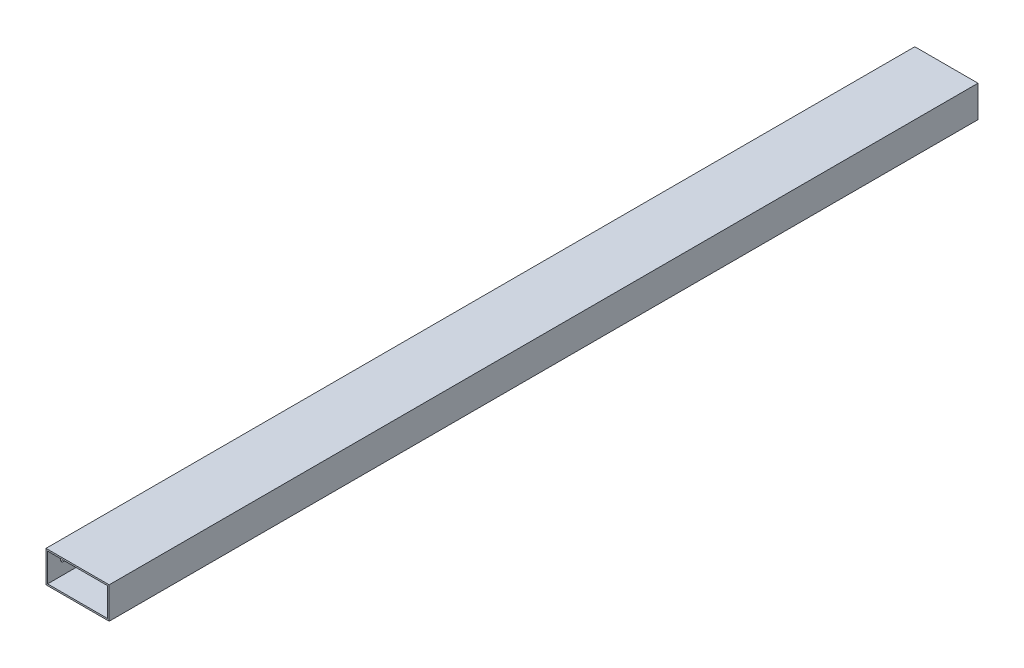
ISO-10303-21;
HEADER;
FILE_DESCRIPTION(('STEP AP214'),'2;1');
FILE_NAME('part.step','',(''),(''),'','','');
FILE_SCHEMA(('AUTOMOTIVE_DESIGN { 1 0 10303 214 1 1 1 1 }'));
ENDSEC;
DATA;
#1=APPLICATION_CONTEXT('core data for automotive mechanical design processes');
#2=APPLICATION_PROTOCOL_DEFINITION('international standard','automotive_design',2000,#1);
#3=PRODUCT_CONTEXT('',#1,'mechanical');
#4=PRODUCT('Part','Part','',(#3));
#5=PRODUCT_RELATED_PRODUCT_CATEGORY('part','',(#4));
#6=PRODUCT_DEFINITION_FORMATION('','',#4);
#7=PRODUCT_DEFINITION_CONTEXT('part definition',#1,'design');
#8=PRODUCT_DEFINITION('design','',#6,#7);
#9=PRODUCT_DEFINITION_SHAPE('','',#8);
#10=(LENGTH_UNIT() NAMED_UNIT(*) SI_UNIT(.MILLI.,.METRE.));
#11=(NAMED_UNIT(*) PLANE_ANGLE_UNIT() SI_UNIT($,.RADIAN.));
#12=(NAMED_UNIT(*) SI_UNIT($,.STERADIAN.) SOLID_ANGLE_UNIT());
#13=UNCERTAINTY_MEASURE_WITH_UNIT(LENGTH_MEASURE(1.E-05),#10,'distance_accuracy_value','');
#14=(GEOMETRIC_REPRESENTATION_CONTEXT(3) GLOBAL_UNCERTAINTY_ASSIGNED_CONTEXT((#13)) GLOBAL_UNIT_ASSIGNED_CONTEXT((#10,
#11,#12)) REPRESENTATION_CONTEXT('',''));
#15=CARTESIAN_POINT('',(0.,0.,0.));
#16=DIRECTION('',(0.,0.,1.));
#17=DIRECTION('',(1.,0.,0.));
#18=AXIS2_PLACEMENT_3D('',#15,#16,#17);
#19=CARTESIAN_POINT('',(0.,0.,550.));
#20=DIRECTION('',(0.,0.,1.));
#21=DIRECTION('',(1.,0.,0.));
#22=AXIS2_PLACEMENT_3D('',#19,#20,#21);
#23=PLANE('',#22);
#24=DIRECTION('',(0.,-1.,0.));
#25=VECTOR('',#24,1.);
#26=CARTESIAN_POINT('',(0.,0.,550.));
#27=LINE('',#26,#25);
#28=CARTESIAN_POINT('',(0.,0.,550.));
#29=VERTEX_POINT('',#28);
#30=CARTESIAN_POINT('',(0.,-20.,550.));
#31=VERTEX_POINT('',#30);
#32=EDGE_CURVE('E169',#29,#31,#27,.T.);
#33=ORIENTED_EDGE('',*,*,#32,.T.);
#34=DIRECTION('',(1.,0.,0.));
#35=VECTOR('',#34,1.);
#36=CARTESIAN_POINT('',(0.,-20.,550.));
#37=LINE('',#36,#35);
#38=CARTESIAN_POINT('',(40.,-20.,550.));
#39=VERTEX_POINT('',#38);
#40=EDGE_CURVE('E172',#31,#39,#37,.T.);
#41=ORIENTED_EDGE('',*,*,#40,.T.);
#42=DIRECTION('',(0.,1.,0.));
#43=VECTOR('',#42,1.);
#44=CARTESIAN_POINT('',(40.,0.,550.));
#45=LINE('',#44,#43);
#46=CARTESIAN_POINT('',(40.,0.,550.));
#47=VERTEX_POINT('',#46);
#48=EDGE_CURVE('E175',#39,#47,#45,.T.);
#49=ORIENTED_EDGE('',*,*,#48,.T.);
#50=DIRECTION('',(-1.,0.,0.));
#51=VECTOR('',#50,1.);
#52=CARTESIAN_POINT('',(0.,0.,550.));
#53=LINE('',#52,#51);
#54=EDGE_CURVE('E177',#47,#29,#53,.T.);
#55=ORIENTED_EDGE('',*,*,#54,.T.);
#56=EDGE_LOOP('',(#33,#41,#49,#55));
#57=FACE_BOUND('',#56,.T.);
#58=DIRECTION('',(1.,0.,0.));
#59=VECTOR('',#58,1.);
#60=CARTESIAN_POINT('',(0.,-19.,550.));
#61=LINE('',#60,#59);
#62=CARTESIAN_POINT('',(1.,-19.,550.));
#63=VERTEX_POINT('',#62);
#64=CARTESIAN_POINT('',(39.,-19.,550.));
#65=VERTEX_POINT('',#64);
#66=EDGE_CURVE('E140',#63,#65,#61,.T.);
#67=ORIENTED_EDGE('',*,*,#66,.F.);
#68=DIRECTION('',(0.,-1.,0.));
#69=VECTOR('',#68,1.);
#70=CARTESIAN_POINT('',(1.,0.,550.));
#71=LINE('',#70,#69);
#72=CARTESIAN_POINT('',(1.,-1.,550.));
#73=VERTEX_POINT('',#72);
#74=EDGE_CURVE('E132',#73,#63,#71,.T.);
#75=ORIENTED_EDGE('',*,*,#74,.F.);
#76=DIRECTION('',(-1.,0.,0.));
#77=VECTOR('',#76,1.);
#78=CARTESIAN_POINT('',(0.,-1.,550.));
#79=LINE('',#78,#77);
#80=CARTESIAN_POINT('',(39.,-1.,550.));
#81=VERTEX_POINT('',#80);
#82=EDGE_CURVE('E154',#81,#73,#79,.T.);
#83=ORIENTED_EDGE('',*,*,#82,.F.);
#84=DIRECTION('',(0.,1.,0.));
#85=VECTOR('',#84,1.);
#86=CARTESIAN_POINT('',(39.,0.,550.));
#87=LINE('',#86,#85);
#88=EDGE_CURVE('E152',#65,#81,#87,.T.);
#89=ORIENTED_EDGE('',*,*,#88,.F.);
#90=EDGE_LOOP('',(#67,#75,#83,#89));
#91=FACE_BOUND('',#90,.T.);
#92=ADVANCED_FACE('F65',(#57,#91),#23,.T.);
#93=CARTESIAN_POINT('',(0.,0.,0.));
#94=DIRECTION('',(0.,0.,1.));
#95=DIRECTION('',(1.,0.,0.));
#96=AXIS2_PLACEMENT_3D('',#93,#94,#95);
#97=PLANE('',#96);
#98=DIRECTION('',(0.,-1.,0.));
#99=VECTOR('',#98,1.);
#100=CARTESIAN_POINT('',(0.,0.,0.));
#101=LINE('',#100,#99);
#102=CARTESIAN_POINT('',(0.,0.,0.));
#103=VERTEX_POINT('',#102);
#104=CARTESIAN_POINT('',(0.,-20.,0.));
#105=VERTEX_POINT('',#104);
#106=EDGE_CURVE('E148',#103,#105,#101,.T.);
#107=ORIENTED_EDGE('',*,*,#106,.F.);
#108=DIRECTION('',(-1.,0.,0.));
#109=VECTOR('',#108,1.);
#110=CARTESIAN_POINT('',(0.,0.,0.));
#111=LINE('',#110,#109);
#112=CARTESIAN_POINT('',(40.,0.,0.));
#113=VERTEX_POINT('',#112);
#114=EDGE_CURVE('E173',#113,#103,#111,.T.);
#115=ORIENTED_EDGE('',*,*,#114,.F.);
#116=DIRECTION('',(0.,1.,0.));
#117=VECTOR('',#116,1.);
#118=CARTESIAN_POINT('',(40.,0.,0.));
#119=LINE('',#118,#117);
#120=CARTESIAN_POINT('',(40.,-20.,0.));
#121=VERTEX_POINT('',#120);
#122=EDGE_CURVE('E184',#121,#113,#119,.T.);
#123=ORIENTED_EDGE('',*,*,#122,.F.);
#124=DIRECTION('',(1.,0.,0.));
#125=VECTOR('',#124,1.);
#126=CARTESIAN_POINT('',(0.,-20.,0.));
#127=LINE('',#126,#125);
#128=EDGE_CURVE('E182',#105,#121,#127,.T.);
#129=ORIENTED_EDGE('',*,*,#128,.F.);
#130=EDGE_LOOP('',(#107,#115,#123,#129));
#131=FACE_BOUND('',#130,.T.);
#132=DIRECTION('',(0.,-1.,0.));
#133=VECTOR('',#132,1.);
#134=CARTESIAN_POINT('',(1.,0.,0.));
#135=LINE('',#134,#133);
#136=CARTESIAN_POINT('',(1.,-1.,0.));
#137=VERTEX_POINT('',#136);
#138=CARTESIAN_POINT('',(1.,-19.,0.));
#139=VERTEX_POINT('',#138);
#140=EDGE_CURVE('E90',#137,#139,#135,.T.);
#141=ORIENTED_EDGE('',*,*,#140,.T.);
#142=DIRECTION('',(1.,0.,0.));
#143=VECTOR('',#142,1.);
#144=CARTESIAN_POINT('',(0.,-19.,0.));
#145=LINE('',#144,#143);
#146=CARTESIAN_POINT('',(39.,-19.,0.));
#147=VERTEX_POINT('',#146);
#148=EDGE_CURVE('E147',#139,#147,#145,.T.);
#149=ORIENTED_EDGE('',*,*,#148,.T.);
#150=DIRECTION('',(0.,1.,0.));
#151=VECTOR('',#150,1.);
#152=CARTESIAN_POINT('',(39.,0.,0.));
#153=LINE('',#152,#151);
#154=CARTESIAN_POINT('',(39.,-1.,0.));
#155=VERTEX_POINT('',#154);
#156=EDGE_CURVE('E161',#147,#155,#153,.T.);
#157=ORIENTED_EDGE('',*,*,#156,.T.);
#158=DIRECTION('',(-1.,0.,0.));
#159=VECTOR('',#158,1.);
#160=CARTESIAN_POINT('',(0.,-1.,0.));
#161=LINE('',#160,#159);
#162=EDGE_CURVE('E141',#155,#137,#161,.T.);
#163=ORIENTED_EDGE('',*,*,#162,.T.);
#164=EDGE_LOOP('',(#141,#149,#157,#163));
#165=FACE_BOUND('',#164,.T.);
#166=ADVANCED_FACE('F212',(#131,#165),#97,.F.);
#167=CARTESIAN_POINT('',(0.,0.,550.));
#168=DIRECTION('',(1.,0.,0.));
#169=DIRECTION('',(0.,0.,-1.));
#170=AXIS2_PLACEMENT_3D('',#167,#168,#169);
#171=PLANE('',#170);
#172=CARTESIAN_POINT('',(0.,-10.,539.996387591484));
#173=DIRECTION('',(-1.,0.,0.));
#174=DIRECTION('',(0.,0.,1.));
#175=AXIS2_PLACEMENT_3D('',#172,#173,#174);
#176=CIRCLE('',#175,1.7500000000001);
#177=CARTESIAN_POINT('',(0.,-10.,541.746387591484));
#178=VERTEX_POINT('',#177);
#179=EDGE_CURVE('E195',#178,#178,#176,.T.);
#180=ORIENTED_EDGE('',*,*,#179,.F.);
#181=EDGE_LOOP('',(#180));
#182=FACE_BOUND('',#181,.T.);
#183=CARTESIAN_POINT('',(0.,-10.0000000016865,9.99999999971425));
#184=DIRECTION('',(-1.,0.,0.));
#185=DIRECTION('',(0.,0.,1.));
#186=AXIS2_PLACEMENT_3D('',#183,#184,#185);
#187=CIRCLE('',#186,1.75000000027376);
#188=CARTESIAN_POINT('',(0.,-10.0000000016865,11.749999999988));
#189=VERTEX_POINT('',#188);
#190=EDGE_CURVE('E200',#189,#189,#187,.T.);
#191=ORIENTED_EDGE('',*,*,#190,.F.);
#192=EDGE_LOOP('',(#191));
#193=FACE_BOUND('',#192,.T.);
#194=ORIENTED_EDGE('',*,*,#106,.T.);
#195=DIRECTION('',(0.,0.,-1.));
#196=VECTOR('',#195,1.);
#197=CARTESIAN_POINT('',(0.,-20.,550.));
#198=LINE('',#197,#196);
#199=EDGE_CURVE('E12',#31,#105,#198,.T.);
#200=ORIENTED_EDGE('',*,*,#199,.F.);
#201=ORIENTED_EDGE('',*,*,#32,.F.);
#202=DIRECTION('',(0.,0.,-1.));
#203=VECTOR('',#202,1.);
#204=CARTESIAN_POINT('',(0.,0.,550.));
#205=LINE('',#204,#203);
#206=EDGE_CURVE('E179',#29,#103,#205,.T.);
#207=ORIENTED_EDGE('',*,*,#206,.T.);
#208=EDGE_LOOP('',(#194,#200,#201,#207));
#209=FACE_BOUND('',#208,.T.);
#210=ADVANCED_FACE('F67',(#182,#193,#209),#171,.F.);
#211=CARTESIAN_POINT('',(0.,-20.,550.));
#212=DIRECTION('',(0.,1.,0.));
#213=DIRECTION('',(0.,0.,1.));
#214=AXIS2_PLACEMENT_3D('',#211,#212,#213);
#215=PLANE('',#214);
#216=ORIENTED_EDGE('',*,*,#128,.T.);
#217=DIRECTION('',(0.,0.,-1.));
#218=VECTOR('',#217,1.);
#219=CARTESIAN_POINT('',(40.,-20.,550.));
#220=LINE('',#219,#218);
#221=EDGE_CURVE('E74',#39,#121,#220,.T.);
#222=ORIENTED_EDGE('',*,*,#221,.F.);
#223=ORIENTED_EDGE('',*,*,#40,.F.);
#224=ORIENTED_EDGE('',*,*,#199,.T.);
#225=EDGE_LOOP('',(#216,#222,#223,#224));
#226=FACE_BOUND('',#225,.T.);
#227=ADVANCED_FACE('F211',(#226),#215,.F.);
#228=CARTESIAN_POINT('',(40.,0.,550.));
#229=DIRECTION('',(-1.,0.,0.));
#230=DIRECTION('',(0.,0.,1.));
#231=AXIS2_PLACEMENT_3D('',#228,#229,#230);
#232=PLANE('',#231);
#233=ORIENTED_EDGE('',*,*,#122,.T.);
#234=DIRECTION('',(0.,0.,-1.));
#235=VECTOR('',#234,1.);
#236=CARTESIAN_POINT('',(40.,0.,550.));
#237=LINE('',#236,#235);
#238=EDGE_CURVE('E189',#47,#113,#237,.T.);
#239=ORIENTED_EDGE('',*,*,#238,.F.);
#240=ORIENTED_EDGE('',*,*,#48,.F.);
#241=ORIENTED_EDGE('',*,*,#221,.T.);
#242=EDGE_LOOP('',(#233,#239,#240,#241));
#243=FACE_BOUND('',#242,.T.);
#244=ADVANCED_FACE('F231',(#243),#232,.F.);
#245=CARTESIAN_POINT('',(0.,0.,550.));
#246=DIRECTION('',(0.,-1.,0.));
#247=DIRECTION('',(0.,0.,-1.));
#248=AXIS2_PLACEMENT_3D('',#245,#246,#247);
#249=PLANE('',#248);
#250=ORIENTED_EDGE('',*,*,#114,.T.);
#251=ORIENTED_EDGE('',*,*,#206,.F.);
#252=ORIENTED_EDGE('',*,*,#54,.F.);
#253=ORIENTED_EDGE('',*,*,#238,.T.);
#254=EDGE_LOOP('',(#250,#251,#252,#253));
#255=FACE_BOUND('',#254,.T.);
#256=ADVANCED_FACE('F229',(#255),#249,.F.);
#257=CARTESIAN_POINT('',(1.,0.,550.));
#258=DIRECTION('',(1.,0.,0.));
#259=DIRECTION('',(0.,0.,-1.));
#260=AXIS2_PLACEMENT_3D('',#257,#258,#259);
#261=PLANE('',#260);
#262=CARTESIAN_POINT('',(1.,-10.,539.996387591484));
#263=DIRECTION('',(1.,0.,0.));
#264=DIRECTION('',(0.,0.,-1.));
#265=AXIS2_PLACEMENT_3D('',#262,#263,#264);
#266=CIRCLE('',#265,1.7500000000001);
#267=CARTESIAN_POINT('',(1.,-10.,538.246387591484));
#268=VERTEX_POINT('',#267);
#269=EDGE_CURVE('E69',#268,#268,#266,.T.);
#270=ORIENTED_EDGE('',*,*,#269,.F.);
#271=EDGE_LOOP('',(#270));
#272=FACE_BOUND('',#271,.T.);
#273=CARTESIAN_POINT('',(1.,-10.0000000016865,9.99999999971425));
#274=DIRECTION('',(1.,0.,0.));
#275=DIRECTION('',(0.,0.,-1.));
#276=AXIS2_PLACEMENT_3D('',#273,#274,#275);
#277=CIRCLE('',#276,1.75000000027376);
#278=CARTESIAN_POINT('',(1.,-10.0000000016865,8.24999999944049));
#279=VERTEX_POINT('',#278);
#280=EDGE_CURVE('E193',#279,#279,#277,.T.);
#281=ORIENTED_EDGE('',*,*,#280,.F.);
#282=EDGE_LOOP('',(#281));
#283=FACE_BOUND('',#282,.T.);
#284=ORIENTED_EDGE('',*,*,#140,.F.);
#285=DIRECTION('',(0.,0.,-1.));
#286=VECTOR('',#285,1.);
#287=CARTESIAN_POINT('',(1.,-1.,550.));
#288=LINE('',#287,#286);
#289=EDGE_CURVE('E136',#73,#137,#288,.T.);
#290=ORIENTED_EDGE('',*,*,#289,.F.);
#291=ORIENTED_EDGE('',*,*,#74,.T.);
#292=DIRECTION('',(0.,0.,-1.));
#293=VECTOR('',#292,1.);
#294=CARTESIAN_POINT('',(1.,-19.,550.));
#295=LINE('',#294,#293);
#296=EDGE_CURVE('E135',#63,#139,#295,.T.);
#297=ORIENTED_EDGE('',*,*,#296,.T.);
#298=EDGE_LOOP('',(#284,#290,#291,#297));
#299=FACE_BOUND('',#298,.T.);
#300=ADVANCED_FACE('F134',(#272,#283,#299),#261,.T.);
#301=CARTESIAN_POINT('',(0.,-19.,550.));
#302=DIRECTION('',(0.,1.,0.));
#303=DIRECTION('',(0.,0.,1.));
#304=AXIS2_PLACEMENT_3D('',#301,#302,#303);
#305=PLANE('',#304);
#306=ORIENTED_EDGE('',*,*,#148,.F.);
#307=ORIENTED_EDGE('',*,*,#296,.F.);
#308=ORIENTED_EDGE('',*,*,#66,.T.);
#309=DIRECTION('',(0.,0.,-1.));
#310=VECTOR('',#309,1.);
#311=CARTESIAN_POINT('',(39.,-19.,550.));
#312=LINE('',#311,#310);
#313=EDGE_CURVE('E149',#65,#147,#312,.T.);
#314=ORIENTED_EDGE('',*,*,#313,.T.);
#315=EDGE_LOOP('',(#306,#307,#308,#314));
#316=FACE_BOUND('',#315,.T.);
#317=ADVANCED_FACE('F144',(#316),#305,.T.);
#318=CARTESIAN_POINT('',(39.,0.,550.));
#319=DIRECTION('',(-1.,0.,0.));
#320=DIRECTION('',(0.,0.,1.));
#321=AXIS2_PLACEMENT_3D('',#318,#319,#320);
#322=PLANE('',#321);
#323=ORIENTED_EDGE('',*,*,#156,.F.);
#324=ORIENTED_EDGE('',*,*,#313,.F.);
#325=ORIENTED_EDGE('',*,*,#88,.T.);
#326=DIRECTION('',(0.,0.,-1.));
#327=VECTOR('',#326,1.);
#328=CARTESIAN_POINT('',(39.,-1.,550.));
#329=LINE('',#328,#327);
#330=EDGE_CURVE('E82',#81,#155,#329,.T.);
#331=ORIENTED_EDGE('',*,*,#330,.T.);
#332=EDGE_LOOP('',(#323,#324,#325,#331));
#333=FACE_BOUND('',#332,.T.);
#334=ADVANCED_FACE('F251',(#333),#322,.T.);
#335=CARTESIAN_POINT('',(0.,-1.,550.));
#336=DIRECTION('',(0.,-1.,0.));
#337=DIRECTION('',(0.,0.,-1.));
#338=AXIS2_PLACEMENT_3D('',#335,#336,#337);
#339=PLANE('',#338);
#340=ORIENTED_EDGE('',*,*,#162,.F.);
#341=ORIENTED_EDGE('',*,*,#330,.F.);
#342=ORIENTED_EDGE('',*,*,#82,.T.);
#343=ORIENTED_EDGE('',*,*,#289,.T.);
#344=EDGE_LOOP('',(#340,#341,#342,#343));
#345=FACE_BOUND('',#344,.T.);
#346=ADVANCED_FACE('F254',(#345),#339,.T.);
#347=CARTESIAN_POINT('',(1.5,-10.0000000016865,9.99999999971425));
#348=DIRECTION('',(-1.,0.,0.));
#349=DIRECTION('',(0.,0.,1.));
#350=AXIS2_PLACEMENT_3D('',#347,#348,#349);
#351=CYLINDRICAL_SURFACE('',#350,1.75000000027376);
#352=ORIENTED_EDGE('',*,*,#280,.T.);
#353=EDGE_LOOP('',(#352));
#354=FACE_BOUND('',#353,.T.);
#355=ORIENTED_EDGE('',*,*,#190,.T.);
#356=EDGE_LOOP('',(#355));
#357=FACE_BOUND('',#356,.T.);
#358=ADVANCED_FACE('F207',(#354,#357),#351,.F.);
#359=CARTESIAN_POINT('',(1.5,-10.,539.996387591484));
#360=DIRECTION('',(-1.,0.,0.));
#361=DIRECTION('',(0.,0.,1.));
#362=AXIS2_PLACEMENT_3D('',#359,#360,#361);
#363=CYLINDRICAL_SURFACE('',#362,1.7500000000001);
#364=ORIENTED_EDGE('',*,*,#269,.T.);
#365=EDGE_LOOP('',(#364));
#366=FACE_BOUND('',#365,.T.);
#367=ORIENTED_EDGE('',*,*,#179,.T.);
#368=EDGE_LOOP('',(#367));
#369=FACE_BOUND('',#368,.T.);
#370=ADVANCED_FACE('F260',(#366,#369),#363,.F.);
#371=CLOSED_SHELL('',(#92,#166,#210,#227,#244,#256,#300,#317,#334,#346,#358,#370));
#372=MANIFOLD_SOLID_BREP('B2',#371);
#373=ADVANCED_BREP_SHAPE_REPRESENTATION('',(#18,#372),#14);
#374=SHAPE_DEFINITION_REPRESENTATION(#9,#373);
ENDSEC;
END-ISO-10303-21;
